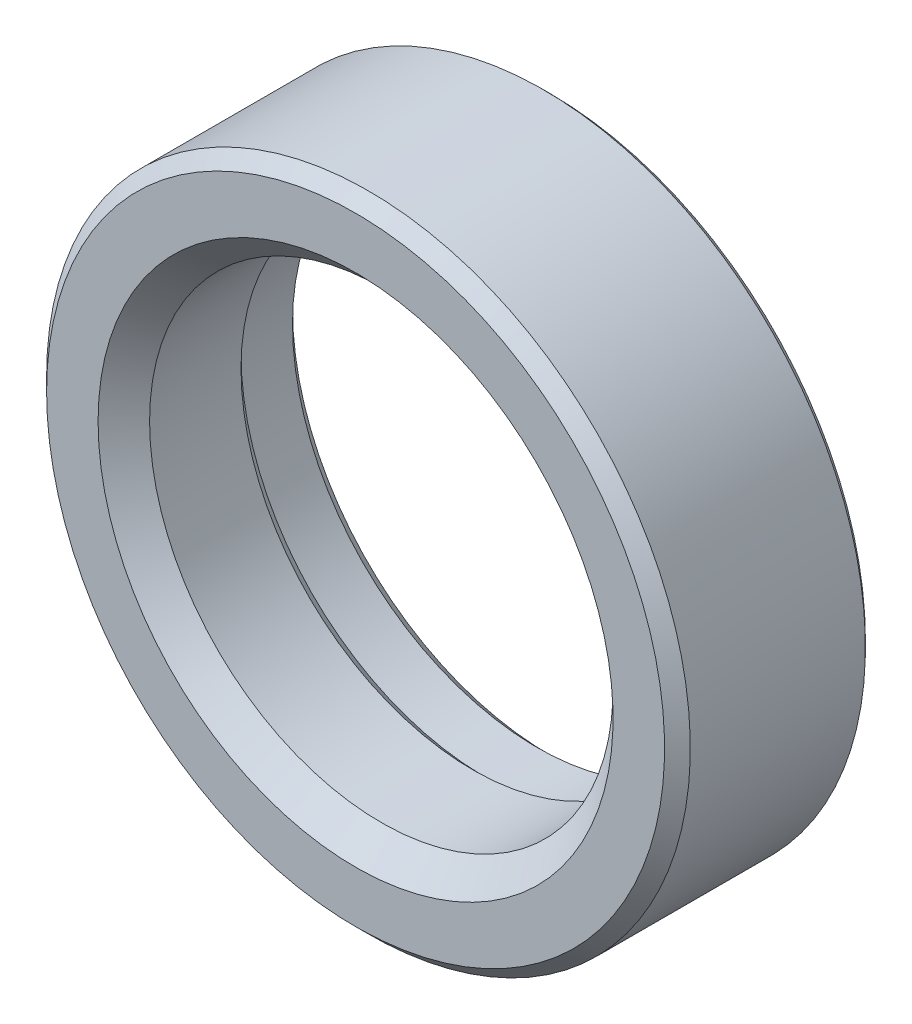
ISO-10303-21;
HEADER;
FILE_DESCRIPTION(('STEP AP214'),'2;1');
FILE_NAME('part.step','',(''),(''),'','','');
FILE_SCHEMA(('AUTOMOTIVE_DESIGN { 1 0 10303 214 1 1 1 1 }'));
ENDSEC;
DATA;
#1=APPLICATION_CONTEXT('core data for automotive mechanical design processes');
#2=APPLICATION_PROTOCOL_DEFINITION('international standard','automotive_design',2000,#1);
#3=PRODUCT_CONTEXT('',#1,'mechanical');
#4=PRODUCT('Part','Part','',(#3));
#5=PRODUCT_RELATED_PRODUCT_CATEGORY('part','',(#4));
#6=PRODUCT_DEFINITION_FORMATION('','',#4);
#7=PRODUCT_DEFINITION_CONTEXT('part definition',#1,'design');
#8=PRODUCT_DEFINITION('design','',#6,#7);
#9=PRODUCT_DEFINITION_SHAPE('','',#8);
#10=(LENGTH_UNIT() NAMED_UNIT(*) SI_UNIT(.MILLI.,.METRE.));
#11=(NAMED_UNIT(*) PLANE_ANGLE_UNIT() SI_UNIT($,.RADIAN.));
#12=(NAMED_UNIT(*) SI_UNIT($,.STERADIAN.) SOLID_ANGLE_UNIT());
#13=UNCERTAINTY_MEASURE_WITH_UNIT(LENGTH_MEASURE(1.E-05),#10,'distance_accuracy_value','');
#14=(GEOMETRIC_REPRESENTATION_CONTEXT(3) GLOBAL_UNCERTAINTY_ASSIGNED_CONTEXT((#13)) GLOBAL_UNIT_ASSIGNED_CONTEXT((#10,
#11,#12)) REPRESENTATION_CONTEXT('',''));
#15=CARTESIAN_POINT('',(0.,0.,0.));
#16=DIRECTION('',(0.,0.,1.));
#17=DIRECTION('',(1.,0.,0.));
#18=AXIS2_PLACEMENT_3D('',#15,#16,#17);
#19=CARTESIAN_POINT('',(0.,-18.,-7.59467455621301));
#20=DIRECTION('',(0.,0.,-1.));
#21=DIRECTION('',(-1.,0.,0.));
#22=AXIS2_PLACEMENT_3D('',#19,#20,#21);
#23=CYLINDRICAL_SURFACE('',#22,18.);
#24=CARTESIAN_POINT('',(0.,-18.,-1.59467455621303));
#25=DIRECTION('',(0.,0.,-1.));
#26=DIRECTION('',(-1.,0.,0.));
#27=AXIS2_PLACEMENT_3D('',#24,#25,#26);
#28=CIRCLE('',#27,18.);
#29=CARTESIAN_POINT('',(-18.,-18.,-1.59467455621303));
#30=VERTEX_POINT('',#29);
#31=EDGE_CURVE('E132',#30,#30,#28,.T.);
#32=ORIENTED_EDGE('',*,*,#31,.T.);
#33=EDGE_LOOP('',(#32));
#34=FACE_BOUND('',#33,.T.);
#35=CARTESIAN_POINT('',(0.,-18.,5.50532544378698));
#36=DIRECTION('',(0.,0.,-1.));
#37=DIRECTION('',(-1.,0.,0.));
#38=AXIS2_PLACEMENT_3D('',#35,#36,#37);
#39=CIRCLE('',#38,18.);
#40=CARTESIAN_POINT('',(-18.,-18.,5.50532544378698));
#41=VERTEX_POINT('',#40);
#42=EDGE_CURVE('E147',#41,#41,#39,.T.);
#43=ORIENTED_EDGE('',*,*,#42,.F.);
#44=EDGE_LOOP('',(#43));
#45=FACE_BOUND('',#44,.T.);
#46=ADVANCED_FACE('F41',(#34,#45),#23,.F.);
#47=CARTESIAN_POINT('',(0.,7.,-7.59467455621301));
#48=DIRECTION('',(0.,0.,-1.));
#49=DIRECTION('',(-1.,0.,0.));
#50=AXIS2_PLACEMENT_3D('',#47,#48,#49);
#51=PLANE('',#50);
#52=CARTESIAN_POINT('',(19.0525588832576,-29.,-7.59467455621301));
#53=DIRECTION('',(0.,0.,-1.));
#54=DIRECTION('',(-1.,0.,0.));
#55=AXIS2_PLACEMENT_3D('',#52,#53,#54);
#56=CIRCLE('',#55,1.45000000000001);
#57=CARTESIAN_POINT('',(17.6025588832576,-29.,-7.59467455621301));
#58=VERTEX_POINT('',#57);
#59=EDGE_CURVE('E84',#58,#58,#56,.F.);
#60=ORIENTED_EDGE('',*,*,#59,.T.);
#61=EDGE_LOOP('',(#60));
#62=FACE_BOUND('',#61,.T.);
#63=CARTESIAN_POINT('',(11.,-37.0525588832577,-7.59467455621301));
#64=DIRECTION('',(0.,0.,-1.));
#65=DIRECTION('',(-1.,0.,0.));
#66=AXIS2_PLACEMENT_3D('',#63,#64,#65);
#67=CIRCLE('',#66,1.44999999999999);
#68=CARTESIAN_POINT('',(9.55000000000001,-37.0525588832577,-7.59467455621301));
#69=VERTEX_POINT('',#68);
#70=EDGE_CURVE('E88',#69,#69,#67,.F.);
#71=ORIENTED_EDGE('',*,*,#70,.T.);
#72=EDGE_LOOP('',(#71));
#73=FACE_BOUND('',#72,.T.);
#74=CARTESIAN_POINT('',(0.,-40.,-7.59467455621301));
#75=DIRECTION('',(0.,0.,-1.));
#76=DIRECTION('',(-1.,0.,0.));
#77=AXIS2_PLACEMENT_3D('',#74,#75,#76);
#78=CIRCLE('',#77,1.44999999999999);
#79=CARTESIAN_POINT('',(-1.44999999999999,-40.,-7.59467455621301));
#80=VERTEX_POINT('',#79);
#81=EDGE_CURVE('E87',#80,#80,#78,.F.);
#82=ORIENTED_EDGE('',*,*,#81,.T.);
#83=EDGE_LOOP('',(#82));
#84=FACE_BOUND('',#83,.T.);
#85=CARTESIAN_POINT('',(-11.,-37.0525588832576,-7.59467455621301));
#86=DIRECTION('',(0.,0.,-1.));
#87=DIRECTION('',(-1.,0.,0.));
#88=AXIS2_PLACEMENT_3D('',#85,#86,#87);
#89=CIRCLE('',#88,1.45000000000001);
#90=CARTESIAN_POINT('',(-12.45,-37.0525588832576,-7.59467455621301));
#91=VERTEX_POINT('',#90);
#92=EDGE_CURVE('E94',#91,#91,#89,.F.);
#93=ORIENTED_EDGE('',*,*,#92,.T.);
#94=EDGE_LOOP('',(#93));
#95=FACE_BOUND('',#94,.T.);
#96=CARTESIAN_POINT('',(-19.0525588832577,-29.,-7.59467455621301));
#97=DIRECTION('',(0.,0.,-1.));
#98=DIRECTION('',(-1.,0.,0.));
#99=AXIS2_PLACEMENT_3D('',#96,#97,#98);
#100=CIRCLE('',#99,1.45000000000001);
#101=CARTESIAN_POINT('',(-20.5025588832577,-29.,-7.59467455621301));
#102=VERTEX_POINT('',#101);
#103=EDGE_CURVE('E91',#102,#102,#100,.F.);
#104=ORIENTED_EDGE('',*,*,#103,.T.);
#105=EDGE_LOOP('',(#104));
#106=FACE_BOUND('',#105,.T.);
#107=CARTESIAN_POINT('',(-22.,-18.,-7.59467455621301));
#108=DIRECTION('',(0.,0.,-1.));
#109=DIRECTION('',(-1.,0.,0.));
#110=AXIS2_PLACEMENT_3D('',#107,#108,#109);
#111=CIRCLE('',#110,1.45000000000001);
#112=CARTESIAN_POINT('',(-23.45,-18.,-7.59467455621301));
#113=VERTEX_POINT('',#112);
#114=EDGE_CURVE('E96',#113,#113,#111,.F.);
#115=ORIENTED_EDGE('',*,*,#114,.T.);
#116=EDGE_LOOP('',(#115));
#117=FACE_BOUND('',#116,.T.);
#118=CARTESIAN_POINT('',(-19.0525588832577,-7.,-7.59467455621301));
#119=DIRECTION('',(0.,0.,-1.));
#120=DIRECTION('',(-1.,0.,0.));
#121=AXIS2_PLACEMENT_3D('',#118,#119,#120);
#122=CIRCLE('',#121,1.45000000000001);
#123=CARTESIAN_POINT('',(-20.5025588832577,-7.,-7.59467455621301));
#124=VERTEX_POINT('',#123);
#125=EDGE_CURVE('E103',#124,#124,#122,.F.);
#126=ORIENTED_EDGE('',*,*,#125,.T.);
#127=EDGE_LOOP('',(#126));
#128=FACE_BOUND('',#127,.T.);
#129=CARTESIAN_POINT('',(-11.,1.05255888325765,-7.59467455621301));
#130=DIRECTION('',(0.,0.,-1.));
#131=DIRECTION('',(-1.,0.,0.));
#132=AXIS2_PLACEMENT_3D('',#129,#130,#131);
#133=CIRCLE('',#132,1.45000000000001);
#134=CARTESIAN_POINT('',(-12.45,1.05255888325765,-7.59467455621301));
#135=VERTEX_POINT('',#134);
#136=EDGE_CURVE('E104',#135,#135,#133,.F.);
#137=ORIENTED_EDGE('',*,*,#136,.T.);
#138=EDGE_LOOP('',(#137));
#139=FACE_BOUND('',#138,.T.);
#140=CARTESIAN_POINT('',(0.,4.,-7.59467455621301));
#141=DIRECTION('',(0.,0.,-1.));
#142=DIRECTION('',(-1.,0.,0.));
#143=AXIS2_PLACEMENT_3D('',#140,#141,#142);
#144=CIRCLE('',#143,1.45000000000001);
#145=CARTESIAN_POINT('',(-1.45000000000001,4.,-7.59467455621301));
#146=VERTEX_POINT('',#145);
#147=EDGE_CURVE('E110',#146,#146,#144,.F.);
#148=ORIENTED_EDGE('',*,*,#147,.T.);
#149=EDGE_LOOP('',(#148));
#150=FACE_BOUND('',#149,.T.);
#151=CARTESIAN_POINT('',(11.,1.05255888325765,-7.59467455621301));
#152=DIRECTION('',(0.,0.,-1.));
#153=DIRECTION('',(-1.,0.,0.));
#154=AXIS2_PLACEMENT_3D('',#151,#152,#153);
#155=CIRCLE('',#154,1.45000000000001);
#156=CARTESIAN_POINT('',(9.55,1.05255888325765,-7.59467455621301));
#157=VERTEX_POINT('',#156);
#158=EDGE_CURVE('E109',#157,#157,#155,.F.);
#159=ORIENTED_EDGE('',*,*,#158,.T.);
#160=EDGE_LOOP('',(#159));
#161=FACE_BOUND('',#160,.T.);
#162=CARTESIAN_POINT('',(19.0525588832577,-7.00000000000001,-7.59467455621301));
#163=DIRECTION('',(0.,0.,-1.));
#164=DIRECTION('',(-1.,0.,0.));
#165=AXIS2_PLACEMENT_3D('',#162,#163,#164);
#166=CIRCLE('',#165,1.45000000000001);
#167=CARTESIAN_POINT('',(17.6025588832577,-7.00000000000001,-7.59467455621301));
#168=VERTEX_POINT('',#167);
#169=EDGE_CURVE('E113',#168,#168,#166,.F.);
#170=ORIENTED_EDGE('',*,*,#169,.T.);
#171=EDGE_LOOP('',(#170));
#172=FACE_BOUND('',#171,.T.);
#173=CARTESIAN_POINT('',(22.,-18.,-7.59467455621301));
#174=DIRECTION('',(0.,0.,-1.));
#175=DIRECTION('',(-1.,0.,0.));
#176=AXIS2_PLACEMENT_3D('',#173,#174,#175);
#177=CIRCLE('',#176,1.44999999999999);
#178=CARTESIAN_POINT('',(20.55,-18.,-7.59467455621301));
#179=VERTEX_POINT('',#178);
#180=EDGE_CURVE('E116',#179,#179,#177,.F.);
#181=ORIENTED_EDGE('',*,*,#180,.T.);
#182=EDGE_LOOP('',(#181));
#183=FACE_BOUND('',#182,.T.);
#184=CARTESIAN_POINT('',(0.,-18.,-7.59467455621301));
#185=DIRECTION('',(0.,0.,-1.));
#186=DIRECTION('',(-1.,0.,0.));
#187=AXIS2_PLACEMENT_3D('',#184,#185,#186);
#188=CIRCLE('',#187,20.);
#189=CARTESIAN_POINT('',(-20.,-18.,-7.59467455621301));
#190=VERTEX_POINT('',#189);
#191=EDGE_CURVE('E125',#190,#190,#188,.F.);
#192=ORIENTED_EDGE('',*,*,#191,.T.);
#193=EDGE_LOOP('',(#192));
#194=FACE_BOUND('',#193,.T.);
#195=CARTESIAN_POINT('',(0.,-18.,-7.59467455621301));
#196=DIRECTION('',(0.,0.,-1.));
#197=DIRECTION('',(-1.,0.,0.));
#198=AXIS2_PLACEMENT_3D('',#195,#196,#197);
#199=CIRCLE('',#198,24.5);
#200=CARTESIAN_POINT('',(-24.5,-18.,-7.59467455621301));
#201=VERTEX_POINT('',#200);
#202=EDGE_CURVE('E133',#201,#201,#199,.T.);
#203=ORIENTED_EDGE('',*,*,#202,.T.);
#204=EDGE_LOOP('',(#203));
#205=FACE_BOUND('',#204,.T.);
#206=ADVANCED_FACE('F209',(#62,#73,#84,#95,#106,#117,#128,#139,#150,#161,#172,#183,#194,#205),
#51,.T.);
#207=CARTESIAN_POINT('',(0.,-18.,-7.59467455621301));
#208=DIRECTION('',(0.,0.,-1.));
#209=DIRECTION('',(-1.,0.,0.));
#210=AXIS2_PLACEMENT_3D('',#207,#208,#209);
#211=CYLINDRICAL_SURFACE('',#210,25.);
#212=CARTESIAN_POINT('',(0.,-18.,-7.09467455621301));
#213=DIRECTION('',(0.,0.,-1.));
#214=DIRECTION('',(-1.,0.,0.));
#215=AXIS2_PLACEMENT_3D('',#212,#213,#214);
#216=CIRCLE('',#215,25.);
#217=CARTESIAN_POINT('',(-25.,-18.,-7.09467455621301));
#218=VERTEX_POINT('',#217);
#219=EDGE_CURVE('E129',#218,#218,#216,.F.);
#220=ORIENTED_EDGE('',*,*,#219,.T.);
#221=EDGE_LOOP('',(#220));
#222=FACE_BOUND('',#221,.T.);
#223=CARTESIAN_POINT('',(0.,-18.,6.50532544378698));
#224=DIRECTION('',(0.,0.,-1.));
#225=DIRECTION('',(-1.,0.,0.));
#226=AXIS2_PLACEMENT_3D('',#223,#224,#225);
#227=CIRCLE('',#226,25.);
#228=CARTESIAN_POINT('',(-25.,-18.,6.50532544378698));
#229=VERTEX_POINT('',#228);
#230=EDGE_CURVE('E139',#229,#229,#227,.T.);
#231=ORIENTED_EDGE('',*,*,#230,.T.);
#232=EDGE_LOOP('',(#231));
#233=FACE_BOUND('',#232,.T.);
#234=ADVANCED_FACE('F220',(#222,#233),#211,.T.);
#235=CARTESIAN_POINT('',(0.,-18.,6.50532544378698));
#236=DIRECTION('',(0.,0.,-1.));
#237=DIRECTION('',(-1.,0.,0.));
#238=AXIS2_PLACEMENT_3D('',#235,#236,#237);
#239=CONICAL_SURFACE('',#238,25.,0.785398163397448);
#240=CARTESIAN_POINT('',(0.,-18.,7.50532544378698));
#241=DIRECTION('',(0.,0.,-1.));
#242=DIRECTION('',(-1.,0.,0.));
#243=AXIS2_PLACEMENT_3D('',#240,#241,#242);
#244=CIRCLE('',#243,24.);
#245=CARTESIAN_POINT('',(-24.,-18.,7.50532544378698));
#246=VERTEX_POINT('',#245);
#247=EDGE_CURVE('E136',#246,#246,#244,.T.);
#248=ORIENTED_EDGE('',*,*,#247,.T.);
#249=EDGE_LOOP('',(#248));
#250=FACE_BOUND('',#249,.T.);
#251=ORIENTED_EDGE('',*,*,#230,.F.);
#252=EDGE_LOOP('',(#251));
#253=FACE_BOUND('',#252,.T.);
#254=ADVANCED_FACE('F233',(#250,#253),#239,.T.);
#255=CARTESIAN_POINT('',(0.,2.,7.50532544378698));
#256=DIRECTION('',(0.,0.,1.));
#257=DIRECTION('',(1.,0.,0.));
#258=AXIS2_PLACEMENT_3D('',#255,#256,#257);
#259=PLANE('',#258);
#260=CARTESIAN_POINT('',(0.,-18.,7.50532544378698));
#261=DIRECTION('',(0.,0.,-1.));
#262=DIRECTION('',(-1.,0.,0.));
#263=AXIS2_PLACEMENT_3D('',#260,#261,#262);
#264=CIRCLE('',#263,20.);
#265=CARTESIAN_POINT('',(-20.,-18.,7.50532544378698));
#266=VERTEX_POINT('',#265);
#267=EDGE_CURVE('E141',#266,#266,#264,.T.);
#268=ORIENTED_EDGE('',*,*,#267,.T.);
#269=EDGE_LOOP('',(#268));
#270=FACE_BOUND('',#269,.T.);
#271=ORIENTED_EDGE('',*,*,#247,.F.);
#272=EDGE_LOOP('',(#271));
#273=FACE_BOUND('',#272,.T.);
#274=ADVANCED_FACE('F227',(#270,#273),#259,.T.);
#275=CARTESIAN_POINT('',(0.,-18.,7.50532544378698));
#276=DIRECTION('',(0.,0.,1.));
#277=DIRECTION('',(1.,0.,0.));
#278=AXIS2_PLACEMENT_3D('',#275,#276,#277);
#279=CONICAL_SURFACE('',#278,20.,0.785398163397449);
#280=ORIENTED_EDGE('',*,*,#42,.T.);
#281=EDGE_LOOP('',(#280));
#282=FACE_BOUND('',#281,.T.);
#283=ORIENTED_EDGE('',*,*,#267,.F.);
#284=EDGE_LOOP('',(#283));
#285=FACE_BOUND('',#284,.T.);
#286=ADVANCED_FACE('F221',(#282,#285),#279,.F.);
#287=CARTESIAN_POINT('',(0.,-18.,-2.59467455621301));
#288=DIRECTION('',(0.,0.,-1.));
#289=DIRECTION('',(-1.,0.,0.));
#290=AXIS2_PLACEMENT_3D('',#287,#288,#289);
#291=CYLINDRICAL_SURFACE('',#290,19.);
#292=CARTESIAN_POINT('',(0.,-18.,-6.59467455621301));
#293=DIRECTION('',(0.,0.,-1.));
#294=DIRECTION('',(-1.,0.,0.));
#295=AXIS2_PLACEMENT_3D('',#292,#293,#294);
#296=CIRCLE('',#295,19.);
#297=CARTESIAN_POINT('',(-19.,-18.,-6.59467455621301));
#298=VERTEX_POINT('',#297);
#299=EDGE_CURVE('E123',#298,#298,#296,.T.);
#300=ORIENTED_EDGE('',*,*,#299,.T.);
#301=EDGE_LOOP('',(#300));
#302=FACE_BOUND('',#301,.T.);
#303=CARTESIAN_POINT('',(0.,-18.,-2.59467455621301));
#304=DIRECTION('',(0.,0.,-1.));
#305=DIRECTION('',(-1.,0.,0.));
#306=AXIS2_PLACEMENT_3D('',#303,#304,#305);
#307=CIRCLE('',#306,19.);
#308=CARTESIAN_POINT('',(-19.,-18.,-2.59467455621301));
#309=VERTEX_POINT('',#308);
#310=EDGE_CURVE('E146',#309,#309,#307,.T.);
#311=ORIENTED_EDGE('',*,*,#310,.F.);
#312=EDGE_LOOP('',(#311));
#313=FACE_BOUND('',#312,.T.);
#314=ADVANCED_FACE('F222',(#302,#313),#291,.F.);
#315=CARTESIAN_POINT('',(0.,-18.,-1.59467455621303));
#316=DIRECTION('',(0.,0.,-1.));
#317=DIRECTION('',(-1.,0.,0.));
#318=AXIS2_PLACEMENT_3D('',#315,#316,#317);
#319=CONICAL_SURFACE('',#318,18.,0.785398163397448);
#320=ORIENTED_EDGE('',*,*,#310,.T.);
#321=EDGE_LOOP('',(#320));
#322=FACE_BOUND('',#321,.T.);
#323=ORIENTED_EDGE('',*,*,#31,.F.);
#324=EDGE_LOOP('',(#323));
#325=FACE_BOUND('',#324,.T.);
#326=ADVANCED_FACE('F239',(#322,#325),#319,.F.);
#327=CARTESIAN_POINT('',(0.,-18.,-7.59467455621301));
#328=DIRECTION('',(0.,0.,1.));
#329=DIRECTION('',(1.,0.,0.));
#330=AXIS2_PLACEMENT_3D('',#327,#328,#329);
#331=CONICAL_SURFACE('',#330,24.5,0.785398163397431);
#332=ORIENTED_EDGE('',*,*,#219,.F.);
#333=EDGE_LOOP('',(#332));
#334=FACE_BOUND('',#333,.T.);
#335=ORIENTED_EDGE('',*,*,#202,.F.);
#336=EDGE_LOOP('',(#335));
#337=FACE_BOUND('',#336,.T.);
#338=ADVANCED_FACE('F244',(#334,#337),#331,.T.);
#339=CARTESIAN_POINT('',(0.,-18.,-6.59467455621301));
#340=DIRECTION('',(0.,0.,-1.));
#341=DIRECTION('',(-1.,0.,0.));
#342=AXIS2_PLACEMENT_3D('',#339,#340,#341);
#343=CONICAL_SURFACE('',#342,19.,0.78539816339745);
#344=ORIENTED_EDGE('',*,*,#191,.F.);
#345=EDGE_LOOP('',(#344));
#346=FACE_BOUND('',#345,.T.);
#347=ORIENTED_EDGE('',*,*,#299,.F.);
#348=EDGE_LOOP('',(#347));
#349=FACE_BOUND('',#348,.T.);
#350=ADVANCED_FACE('F255',(#346,#349),#343,.F.);
#351=CARTESIAN_POINT('',(19.0525588832576,-29.,-0.0946745562130143));
#352=DIRECTION('',(0.,0.,-1.));
#353=DIRECTION('',(-1.,0.,0.));
#354=AXIS2_PLACEMENT_3D('',#351,#352,#353);
#355=CYLINDRICAL_SURFACE('',#354,1.25);
#356=CARTESIAN_POINT('',(19.0525588832576,-29.,-7.39467455621301));
#357=DIRECTION('',(0.,0.,-1.));
#358=DIRECTION('',(-1.,0.,0.));
#359=AXIS2_PLACEMENT_3D('',#356,#357,#358);
#360=CIRCLE('',#359,1.25);
#361=CARTESIAN_POINT('',(17.8025588832576,-29.,-7.39467455621301));
#362=VERTEX_POINT('',#361);
#363=EDGE_CURVE('E118',#362,#362,#360,.T.);
#364=ORIENTED_EDGE('',*,*,#363,.T.);
#365=EDGE_LOOP('',(#364));
#366=FACE_BOUND('',#365,.T.);
#367=CARTESIAN_POINT('',(19.0525588832576,-29.,-0.0946745562130143));
#368=DIRECTION('',(0.,0.,-1.));
#369=DIRECTION('',(-1.,0.,0.));
#370=AXIS2_PLACEMENT_3D('',#367,#368,#369);
#371=CIRCLE('',#370,1.25);
#372=CARTESIAN_POINT('',(17.8025588832576,-29.,-0.0946745562130143));
#373=VERTEX_POINT('',#372);
#374=EDGE_CURVE('E168',#373,#373,#371,.T.);
#375=ORIENTED_EDGE('',*,*,#374,.F.);
#376=EDGE_LOOP('',(#375));
#377=FACE_BOUND('',#376,.T.);
#378=ADVANCED_FACE('F256',(#366,#377),#355,.F.);
#379=CARTESIAN_POINT('',(19.0525588832576,-29.,-0.0946745562130143));
#380=DIRECTION('',(0.,0.,-1.));
#381=DIRECTION('',(-1.,0.,0.));
#382=AXIS2_PLACEMENT_3D('',#379,#380,#381);
#383=PLANE('',#382);
#384=ORIENTED_EDGE('',*,*,#374,.T.);
#385=EDGE_LOOP('',(#384));
#386=FACE_BOUND('',#385,.T.);
#387=ADVANCED_FACE('F371',(#386),#383,.T.);
#388=CARTESIAN_POINT('',(11.,-37.0525588832577,-0.0946745562130143));
#389=DIRECTION('',(0.,0.,-1.));
#390=DIRECTION('',(-1.,0.,0.));
#391=AXIS2_PLACEMENT_3D('',#388,#389,#390);
#392=CYLINDRICAL_SURFACE('',#391,1.25);
#393=CARTESIAN_POINT('',(11.,-37.0525588832577,-7.39467455621303));
#394=DIRECTION('',(0.,0.,-1.));
#395=DIRECTION('',(-1.,0.,0.));
#396=AXIS2_PLACEMENT_3D('',#393,#394,#395);
#397=CIRCLE('',#396,1.25);
#398=CARTESIAN_POINT('',(9.74999999999999,-37.0525588832577,-7.39467455621303));
#399=VERTEX_POINT('',#398);
#400=EDGE_CURVE('E78',#399,#399,#397,.T.);
#401=ORIENTED_EDGE('',*,*,#400,.T.);
#402=EDGE_LOOP('',(#401));
#403=FACE_BOUND('',#402,.T.);
#404=CARTESIAN_POINT('',(11.,-37.0525588832577,-0.0946745562130143));
#405=DIRECTION('',(0.,0.,-1.));
#406=DIRECTION('',(-1.,0.,0.));
#407=AXIS2_PLACEMENT_3D('',#404,#405,#406);
#408=CIRCLE('',#407,1.25);
#409=CARTESIAN_POINT('',(9.74999999999999,-37.0525588832577,-0.0946745562130143));
#410=VERTEX_POINT('',#409);
#411=EDGE_CURVE('E169',#410,#410,#408,.T.);
#412=ORIENTED_EDGE('',*,*,#411,.F.);
#413=EDGE_LOOP('',(#412));
#414=FACE_BOUND('',#413,.T.);
#415=ADVANCED_FACE('F374',(#403,#414),#392,.F.);
#416=CARTESIAN_POINT('',(11.,-37.0525588832577,-0.0946745562130143));
#417=DIRECTION('',(0.,0.,-1.));
#418=DIRECTION('',(-1.,0.,0.));
#419=AXIS2_PLACEMENT_3D('',#416,#417,#418);
#420=PLANE('',#419);
#421=ORIENTED_EDGE('',*,*,#411,.T.);
#422=EDGE_LOOP('',(#421));
#423=FACE_BOUND('',#422,.T.);
#424=ADVANCED_FACE('F385',(#423),#420,.T.);
#425=CARTESIAN_POINT('',(0.,-40.,-0.0946745562130143));
#426=DIRECTION('',(0.,0.,-1.));
#427=DIRECTION('',(-1.,0.,0.));
#428=AXIS2_PLACEMENT_3D('',#425,#426,#427);
#429=CYLINDRICAL_SURFACE('',#428,1.25);
#430=CARTESIAN_POINT('',(0.,-40.,-7.39467455621303));
#431=DIRECTION('',(0.,0.,-1.));
#432=DIRECTION('',(-1.,0.,0.));
#433=AXIS2_PLACEMENT_3D('',#430,#431,#432);
#434=CIRCLE('',#433,1.25);
#435=CARTESIAN_POINT('',(-1.25,-40.,-7.39467455621303));
#436=VERTEX_POINT('',#435);
#437=EDGE_CURVE('E80',#436,#436,#434,.T.);
#438=ORIENTED_EDGE('',*,*,#437,.T.);
#439=EDGE_LOOP('',(#438));
#440=FACE_BOUND('',#439,.T.);
#441=CARTESIAN_POINT('',(0.,-40.,-0.0946745562130143));
#442=DIRECTION('',(0.,0.,-1.));
#443=DIRECTION('',(-1.,0.,0.));
#444=AXIS2_PLACEMENT_3D('',#441,#442,#443);
#445=CIRCLE('',#444,1.25);
#446=CARTESIAN_POINT('',(-1.25,-40.,-0.0946745562130143));
#447=VERTEX_POINT('',#446);
#448=EDGE_CURVE('E173',#447,#447,#445,.T.);
#449=ORIENTED_EDGE('',*,*,#448,.F.);
#450=EDGE_LOOP('',(#449));
#451=FACE_BOUND('',#450,.T.);
#452=ADVANCED_FACE('F387',(#440,#451),#429,.F.);
#453=CARTESIAN_POINT('',(0.,-40.,-0.0946745562130143));
#454=DIRECTION('',(0.,0.,-1.));
#455=DIRECTION('',(-1.,0.,0.));
#456=AXIS2_PLACEMENT_3D('',#453,#454,#455);
#457=PLANE('',#456);
#458=ORIENTED_EDGE('',*,*,#448,.T.);
#459=EDGE_LOOP('',(#458));
#460=FACE_BOUND('',#459,.T.);
#461=ADVANCED_FACE('F391',(#460),#457,.T.);
#462=CARTESIAN_POINT('',(-11.,-37.0525588832576,-0.0946745562130143));
#463=DIRECTION('',(0.,0.,-1.));
#464=DIRECTION('',(-1.,0.,0.));
#465=AXIS2_PLACEMENT_3D('',#462,#463,#464);
#466=CYLINDRICAL_SURFACE('',#465,1.25);
#467=CARTESIAN_POINT('',(-11.,-37.0525588832576,-7.39467455621301));
#468=DIRECTION('',(0.,0.,-1.));
#469=DIRECTION('',(-1.,0.,0.));
#470=AXIS2_PLACEMENT_3D('',#467,#468,#469);
#471=CIRCLE('',#470,1.25);
#472=CARTESIAN_POINT('',(-12.25,-37.0525588832576,-7.39467455621301));
#473=VERTEX_POINT('',#472);
#474=EDGE_CURVE('E75',#473,#473,#471,.T.);
#475=ORIENTED_EDGE('',*,*,#474,.T.);
#476=EDGE_LOOP('',(#475));
#477=FACE_BOUND('',#476,.T.);
#478=CARTESIAN_POINT('',(-11.,-37.0525588832576,-0.0946745562130143));
#479=DIRECTION('',(0.,0.,-1.));
#480=DIRECTION('',(-1.,0.,0.));
#481=AXIS2_PLACEMENT_3D('',#478,#479,#480);
#482=CIRCLE('',#481,1.25);
#483=CARTESIAN_POINT('',(-12.25,-37.0525588832576,-0.0946745562130143));
#484=VERTEX_POINT('',#483);
#485=EDGE_CURVE('E159',#484,#484,#482,.T.);
#486=ORIENTED_EDGE('',*,*,#485,.F.);
#487=EDGE_LOOP('',(#486));
#488=FACE_BOUND('',#487,.T.);
#489=ADVANCED_FACE('F399',(#477,#488),#466,.F.);
#490=CARTESIAN_POINT('',(-11.,-37.0525588832576,-0.0946745562130143));
#491=DIRECTION('',(0.,0.,-1.));
#492=DIRECTION('',(-1.,0.,0.));
#493=AXIS2_PLACEMENT_3D('',#490,#491,#492);
#494=PLANE('',#493);
#495=ORIENTED_EDGE('',*,*,#485,.T.);
#496=EDGE_LOOP('',(#495));
#497=FACE_BOUND('',#496,.T.);
#498=ADVANCED_FACE('F404',(#497),#494,.T.);
#499=CARTESIAN_POINT('',(-19.0525588832577,-29.,-0.0946745562130143));
#500=DIRECTION('',(0.,0.,-1.));
#501=DIRECTION('',(-1.,0.,0.));
#502=AXIS2_PLACEMENT_3D('',#499,#500,#501);
#503=CYLINDRICAL_SURFACE('',#502,1.25);
#504=CARTESIAN_POINT('',(-19.0525588832577,-29.,-7.39467455621301));
#505=DIRECTION('',(0.,0.,-1.));
#506=DIRECTION('',(-1.,0.,0.));
#507=AXIS2_PLACEMENT_3D('',#504,#505,#506);
#508=CIRCLE('',#507,1.25);
#509=CARTESIAN_POINT('',(-20.3025588832577,-29.,-7.39467455621301));
#510=VERTEX_POINT('',#509);
#511=EDGE_CURVE('E73',#510,#510,#508,.T.);
#512=ORIENTED_EDGE('',*,*,#511,.T.);
#513=EDGE_LOOP('',(#512));
#514=FACE_BOUND('',#513,.T.);
#515=CARTESIAN_POINT('',(-19.0525588832577,-29.,-0.0946745562130143));
#516=DIRECTION('',(0.,0.,-1.));
#517=DIRECTION('',(-1.,0.,0.));
#518=AXIS2_PLACEMENT_3D('',#515,#516,#517);
#519=CIRCLE('',#518,1.25);
#520=CARTESIAN_POINT('',(-20.3025588832577,-29.,-0.0946745562130143));
#521=VERTEX_POINT('',#520);
#522=EDGE_CURVE('E151',#521,#521,#519,.T.);
#523=ORIENTED_EDGE('',*,*,#522,.F.);
#524=EDGE_LOOP('',(#523));
#525=FACE_BOUND('',#524,.T.);
#526=ADVANCED_FACE('F409',(#514,#525),#503,.F.);
#527=CARTESIAN_POINT('',(-19.0525588832577,-29.,-0.0946745562130143));
#528=DIRECTION('',(0.,0.,-1.));
#529=DIRECTION('',(-1.,0.,0.));
#530=AXIS2_PLACEMENT_3D('',#527,#528,#529);
#531=PLANE('',#530);
#532=ORIENTED_EDGE('',*,*,#522,.T.);
#533=EDGE_LOOP('',(#532));
#534=FACE_BOUND('',#533,.T.);
#535=ADVANCED_FACE('F414',(#534),#531,.T.);
#536=CARTESIAN_POINT('',(-22.,-18.,-0.0946745562130143));
#537=DIRECTION('',(0.,0.,-1.));
#538=DIRECTION('',(-1.,0.,0.));
#539=AXIS2_PLACEMENT_3D('',#536,#537,#538);
#540=CYLINDRICAL_SURFACE('',#539,1.25);
#541=CARTESIAN_POINT('',(-22.,-18.,-7.39467455621301));
#542=DIRECTION('',(0.,0.,-1.));
#543=DIRECTION('',(-1.,0.,0.));
#544=AXIS2_PLACEMENT_3D('',#541,#542,#543);
#545=CIRCLE('',#544,1.25);
#546=CARTESIAN_POINT('',(-23.25,-18.,-7.39467455621301));
#547=VERTEX_POINT('',#546);
#548=EDGE_CURVE('E66',#547,#547,#545,.T.);
#549=ORIENTED_EDGE('',*,*,#548,.T.);
#550=EDGE_LOOP('',(#549));
#551=FACE_BOUND('',#550,.T.);
#552=CARTESIAN_POINT('',(-22.,-18.,-0.0946745562130143));
#553=DIRECTION('',(0.,0.,-1.));
#554=DIRECTION('',(-1.,0.,0.));
#555=AXIS2_PLACEMENT_3D('',#552,#553,#554);
#556=CIRCLE('',#555,1.25);
#557=CARTESIAN_POINT('',(-23.25,-18.,-0.0946745562130143));
#558=VERTEX_POINT('',#557);
#559=EDGE_CURVE('E158',#558,#558,#556,.T.);
#560=ORIENTED_EDGE('',*,*,#559,.F.);
#561=EDGE_LOOP('',(#560));
#562=FACE_BOUND('',#561,.T.);
#563=ADVANCED_FACE('F420',(#551,#562),#540,.F.);
#564=CARTESIAN_POINT('',(-22.,-18.,-0.0946745562130143));
#565=DIRECTION('',(0.,0.,-1.));
#566=DIRECTION('',(-1.,0.,0.));
#567=AXIS2_PLACEMENT_3D('',#564,#565,#566);
#568=PLANE('',#567);
#569=ORIENTED_EDGE('',*,*,#559,.T.);
#570=EDGE_LOOP('',(#569));
#571=FACE_BOUND('',#570,.T.);
#572=ADVANCED_FACE('F424',(#571),#568,.T.);
#573=CARTESIAN_POINT('',(-19.0525588832577,-7.,-0.0946745562130143));
#574=DIRECTION('',(0.,0.,-1.));
#575=DIRECTION('',(-1.,0.,0.));
#576=AXIS2_PLACEMENT_3D('',#573,#574,#575);
#577=CYLINDRICAL_SURFACE('',#576,1.25);
#578=CARTESIAN_POINT('',(-19.0525588832577,-7.,-7.39467455621301));
#579=DIRECTION('',(0.,0.,-1.));
#580=DIRECTION('',(-1.,0.,0.));
#581=AXIS2_PLACEMENT_3D('',#578,#579,#580);
#582=CIRCLE('',#581,1.25);
#583=CARTESIAN_POINT('',(-20.3025588832577,-7.,-7.39467455621301));
#584=VERTEX_POINT('',#583);
#585=EDGE_CURVE('E63',#584,#584,#582,.T.);
#586=ORIENTED_EDGE('',*,*,#585,.T.);
#587=EDGE_LOOP('',(#586));
#588=FACE_BOUND('',#587,.T.);
#589=CARTESIAN_POINT('',(-19.0525588832577,-7.,-0.0946745562130143));
#590=DIRECTION('',(0.,0.,-1.));
#591=DIRECTION('',(-1.,0.,0.));
#592=AXIS2_PLACEMENT_3D('',#589,#590,#591);
#593=CIRCLE('',#592,1.25);
#594=CARTESIAN_POINT('',(-20.3025588832577,-7.,-0.0946745562130143));
#595=VERTEX_POINT('',#594);
#596=EDGE_CURVE('E156',#595,#595,#593,.T.);
#597=ORIENTED_EDGE('',*,*,#596,.F.);
#598=EDGE_LOOP('',(#597));
#599=FACE_BOUND('',#598,.T.);
#600=ADVANCED_FACE('F429',(#588,#599),#577,.F.);
#601=CARTESIAN_POINT('',(-19.0525588832577,-7.,-0.0946745562130143));
#602=DIRECTION('',(0.,0.,-1.));
#603=DIRECTION('',(-1.,0.,0.));
#604=AXIS2_PLACEMENT_3D('',#601,#602,#603);
#605=PLANE('',#604);
#606=ORIENTED_EDGE('',*,*,#596,.T.);
#607=EDGE_LOOP('',(#606));
#608=FACE_BOUND('',#607,.T.);
#609=ADVANCED_FACE('F436',(#608),#605,.T.);
#610=CARTESIAN_POINT('',(-11.,1.05255888325765,-0.0946745562130143));
#611=DIRECTION('',(0.,0.,-1.));
#612=DIRECTION('',(-1.,0.,0.));
#613=AXIS2_PLACEMENT_3D('',#610,#611,#612);
#614=CYLINDRICAL_SURFACE('',#613,1.25);
#615=CARTESIAN_POINT('',(-11.,1.05255888325765,-7.39467455621301));
#616=DIRECTION('',(0.,0.,-1.));
#617=DIRECTION('',(-1.,0.,0.));
#618=AXIS2_PLACEMENT_3D('',#615,#616,#617);
#619=CIRCLE('',#618,1.25);
#620=CARTESIAN_POINT('',(-12.25,1.05255888325765,-7.39467455621301));
#621=VERTEX_POINT('',#620);
#622=EDGE_CURVE('E65',#621,#621,#619,.T.);
#623=ORIENTED_EDGE('',*,*,#622,.T.);
#624=EDGE_LOOP('',(#623));
#625=FACE_BOUND('',#624,.T.);
#626=CARTESIAN_POINT('',(-11.,1.05255888325765,-0.0946745562130143));
#627=DIRECTION('',(0.,0.,-1.));
#628=DIRECTION('',(-1.,0.,0.));
#629=AXIS2_PLACEMENT_3D('',#626,#627,#628);
#630=CIRCLE('',#629,1.25);
#631=CARTESIAN_POINT('',(-12.25,1.05255888325765,-0.0946745562130143));
#632=VERTEX_POINT('',#631);
#633=EDGE_CURVE('E161',#632,#632,#630,.T.);
#634=ORIENTED_EDGE('',*,*,#633,.F.);
#635=EDGE_LOOP('',(#634));
#636=FACE_BOUND('',#635,.T.);
#637=ADVANCED_FACE('F439',(#625,#636),#614,.F.);
#638=CARTESIAN_POINT('',(-11.,1.05255888325765,-0.0946745562130143));
#639=DIRECTION('',(0.,0.,-1.));
#640=DIRECTION('',(-1.,0.,0.));
#641=AXIS2_PLACEMENT_3D('',#638,#639,#640);
#642=PLANE('',#641);
#643=ORIENTED_EDGE('',*,*,#633,.T.);
#644=EDGE_LOOP('',(#643));
#645=FACE_BOUND('',#644,.T.);
#646=ADVANCED_FACE('F450',(#645),#642,.T.);
#647=CARTESIAN_POINT('',(22.,-18.,-0.0946745562130143));
#648=DIRECTION('',(0.,0.,-1.));
#649=DIRECTION('',(-1.,0.,0.));
#650=AXIS2_PLACEMENT_3D('',#647,#648,#649);
#651=CYLINDRICAL_SURFACE('',#650,1.25);
#652=CARTESIAN_POINT('',(22.,-18.,-7.39467455621303));
#653=DIRECTION('',(0.,0.,-1.));
#654=DIRECTION('',(-1.,0.,0.));
#655=AXIS2_PLACEMENT_3D('',#652,#653,#654);
#656=CIRCLE('',#655,1.25);
#657=CARTESIAN_POINT('',(20.75,-18.,-7.39467455621303));
#658=VERTEX_POINT('',#657);
#659=EDGE_CURVE('E10',#658,#658,#656,.T.);
#660=ORIENTED_EDGE('',*,*,#659,.T.);
#661=EDGE_LOOP('',(#660));
#662=FACE_BOUND('',#661,.T.);
#663=CARTESIAN_POINT('',(22.,-18.,-0.0946745562130143));
#664=DIRECTION('',(0.,0.,-1.));
#665=DIRECTION('',(-1.,0.,0.));
#666=AXIS2_PLACEMENT_3D('',#663,#664,#665);
#667=CIRCLE('',#666,1.25);
#668=CARTESIAN_POINT('',(20.75,-18.,-0.0946745562130143));
#669=VERTEX_POINT('',#668);
#670=EDGE_CURVE('E167',#669,#669,#667,.T.);
#671=ORIENTED_EDGE('',*,*,#670,.F.);
#672=EDGE_LOOP('',(#671));
#673=FACE_BOUND('',#672,.T.);
#674=ADVANCED_FACE('F452',(#662,#673),#651,.F.);
#675=CARTESIAN_POINT('',(22.,-18.,-0.0946745562130143));
#676=DIRECTION('',(0.,0.,-1.));
#677=DIRECTION('',(-1.,0.,0.));
#678=AXIS2_PLACEMENT_3D('',#675,#676,#677);
#679=PLANE('',#678);
#680=ORIENTED_EDGE('',*,*,#670,.T.);
#681=EDGE_LOOP('',(#680));
#682=FACE_BOUND('',#681,.T.);
#683=ADVANCED_FACE('F456',(#682),#679,.T.);
#684=CARTESIAN_POINT('',(19.0525588832577,-7.00000000000001,-0.0946745562130143));
#685=DIRECTION('',(0.,0.,-1.));
#686=DIRECTION('',(-1.,0.,0.));
#687=AXIS2_PLACEMENT_3D('',#684,#685,#686);
#688=CYLINDRICAL_SURFACE('',#687,1.25);
#689=CARTESIAN_POINT('',(19.0525588832577,-7.00000000000001,-7.39467455621301));
#690=DIRECTION('',(0.,0.,-1.));
#691=DIRECTION('',(-1.,0.,0.));
#692=AXIS2_PLACEMENT_3D('',#689,#690,#691);
#693=CIRCLE('',#692,1.25);
#694=CARTESIAN_POINT('',(17.8025588832577,-7.00000000000001,-7.39467455621301));
#695=VERTEX_POINT('',#694);
#696=EDGE_CURVE('E47',#695,#695,#693,.T.);
#697=ORIENTED_EDGE('',*,*,#696,.T.);
#698=EDGE_LOOP('',(#697));
#699=FACE_BOUND('',#698,.T.);
#700=CARTESIAN_POINT('',(19.0525588832577,-7.00000000000001,-0.0946745562130143));
#701=DIRECTION('',(0.,0.,-1.));
#702=DIRECTION('',(-1.,0.,0.));
#703=AXIS2_PLACEMENT_3D('',#700,#701,#702);
#704=CIRCLE('',#703,1.25);
#705=CARTESIAN_POINT('',(17.8025588832577,-7.00000000000001,-0.0946745562130143));
#706=VERTEX_POINT('',#705);
#707=EDGE_CURVE('E181',#706,#706,#704,.T.);
#708=ORIENTED_EDGE('',*,*,#707,.F.);
#709=EDGE_LOOP('',(#708));
#710=FACE_BOUND('',#709,.T.);
#711=ADVANCED_FACE('F464',(#699,#710),#688,.F.);
#712=CARTESIAN_POINT('',(19.0525588832577,-7.00000000000001,-0.0946745562130143));
#713=DIRECTION('',(0.,0.,-1.));
#714=DIRECTION('',(-1.,0.,0.));
#715=AXIS2_PLACEMENT_3D('',#712,#713,#714);
#716=PLANE('',#715);
#717=ORIENTED_EDGE('',*,*,#707,.T.);
#718=EDGE_LOOP('',(#717));
#719=FACE_BOUND('',#718,.T.);
#720=ADVANCED_FACE('F469',(#719),#716,.T.);
#721=CARTESIAN_POINT('',(11.,1.05255888325765,-0.0946745562130143));
#722=DIRECTION('',(0.,0.,-1.));
#723=DIRECTION('',(-1.,0.,0.));
#724=AXIS2_PLACEMENT_3D('',#721,#722,#723);
#725=CYLINDRICAL_SURFACE('',#724,1.25);
#726=CARTESIAN_POINT('',(11.,1.05255888325765,-7.39467455621301));
#727=DIRECTION('',(0.,0.,-1.));
#728=DIRECTION('',(-1.,0.,0.));
#729=AXIS2_PLACEMENT_3D('',#726,#727,#728);
#730=CIRCLE('',#729,1.25);
#731=CARTESIAN_POINT('',(9.75000000000001,1.05255888325765,-7.39467455621301));
#732=VERTEX_POINT('',#731);
#733=EDGE_CURVE('E52',#732,#732,#730,.T.);
#734=ORIENTED_EDGE('',*,*,#733,.T.);
#735=EDGE_LOOP('',(#734));
#736=FACE_BOUND('',#735,.T.);
#737=CARTESIAN_POINT('',(11.,1.05255888325765,-0.0946745562130143));
#738=DIRECTION('',(0.,0.,-1.));
#739=DIRECTION('',(-1.,0.,0.));
#740=AXIS2_PLACEMENT_3D('',#737,#738,#739);
#741=CIRCLE('',#740,1.25);
#742=CARTESIAN_POINT('',(9.75000000000001,1.05255888325765,-0.0946745562130143));
#743=VERTEX_POINT('',#742);
#744=EDGE_CURVE('E178',#743,#743,#741,.T.);
#745=ORIENTED_EDGE('',*,*,#744,.F.);
#746=EDGE_LOOP('',(#745));
#747=FACE_BOUND('',#746,.T.);
#748=ADVANCED_FACE('F205',(#736,#747),#725,.F.);
#749=CARTESIAN_POINT('',(11.,1.05255888325765,-0.0946745562130143));
#750=DIRECTION('',(0.,0.,-1.));
#751=DIRECTION('',(-1.,0.,0.));
#752=AXIS2_PLACEMENT_3D('',#749,#750,#751);
#753=PLANE('',#752);
#754=ORIENTED_EDGE('',*,*,#744,.T.);
#755=EDGE_LOOP('',(#754));
#756=FACE_BOUND('',#755,.T.);
#757=ADVANCED_FACE('F194',(#756),#753,.T.);
#758=CARTESIAN_POINT('',(0.,4.,-0.0946745562130143));
#759=DIRECTION('',(0.,0.,-1.));
#760=DIRECTION('',(-1.,0.,0.));
#761=AXIS2_PLACEMENT_3D('',#758,#759,#760);
#762=CYLINDRICAL_SURFACE('',#761,1.25);
#763=CARTESIAN_POINT('',(0.,4.,-7.39467455621301));
#764=DIRECTION('',(0.,0.,-1.));
#765=DIRECTION('',(-1.,0.,0.));
#766=AXIS2_PLACEMENT_3D('',#763,#764,#765);
#767=CIRCLE('',#766,1.25);
#768=CARTESIAN_POINT('',(-1.25,4.,-7.39467455621301));
#769=VERTEX_POINT('',#768);
#770=EDGE_CURVE('E60',#769,#769,#767,.T.);
#771=ORIENTED_EDGE('',*,*,#770,.T.);
#772=EDGE_LOOP('',(#771));
#773=FACE_BOUND('',#772,.T.);
#774=CARTESIAN_POINT('',(0.,4.,-0.0946745562130143));
#775=DIRECTION('',(0.,0.,-1.));
#776=DIRECTION('',(-1.,0.,0.));
#777=AXIS2_PLACEMENT_3D('',#774,#775,#776);
#778=CIRCLE('',#777,1.25);
#779=CARTESIAN_POINT('',(-1.25,4.,-0.0946745562130143));
#780=VERTEX_POINT('',#779);
#781=EDGE_CURVE('E155',#780,#780,#778,.T.);
#782=ORIENTED_EDGE('',*,*,#781,.F.);
#783=EDGE_LOOP('',(#782));
#784=FACE_BOUND('',#783,.T.);
#785=ADVANCED_FACE('F192',(#773,#784),#762,.F.);
#786=CARTESIAN_POINT('',(0.,4.,-0.0946745562130143));
#787=DIRECTION('',(0.,0.,-1.));
#788=DIRECTION('',(-1.,0.,0.));
#789=AXIS2_PLACEMENT_3D('',#786,#787,#788);
#790=PLANE('',#789);
#791=ORIENTED_EDGE('',*,*,#781,.T.);
#792=EDGE_LOOP('',(#791));
#793=FACE_BOUND('',#792,.T.);
#794=ADVANCED_FACE('F186',(#793),#790,.T.);
#795=CARTESIAN_POINT('',(19.0525588832576,-29.,-7.39467455621301));
#796=DIRECTION('',(0.,0.,-1.));
#797=DIRECTION('',(-1.,0.,0.));
#798=AXIS2_PLACEMENT_3D('',#795,#796,#797);
#799=CONICAL_SURFACE('',#798,1.25,0.785398163397448);
#800=ORIENTED_EDGE('',*,*,#59,.F.);
#801=EDGE_LOOP('',(#800));
#802=FACE_BOUND('',#801,.T.);
#803=ORIENTED_EDGE('',*,*,#363,.F.);
#804=EDGE_LOOP('',(#803));
#805=FACE_BOUND('',#804,.T.);
#806=ADVANCED_FACE('F203',(#802,#805),#799,.F.);
#807=CARTESIAN_POINT('',(11.,-37.0525588832577,-7.39467455621303));
#808=DIRECTION('',(0.,0.,-1.));
#809=DIRECTION('',(-1.,0.,0.));
#810=AXIS2_PLACEMENT_3D('',#807,#808,#809);
#811=CONICAL_SURFACE('',#810,1.25,0.785398163397448);
#812=ORIENTED_EDGE('',*,*,#70,.F.);
#813=EDGE_LOOP('',(#812));
#814=FACE_BOUND('',#813,.T.);
#815=ORIENTED_EDGE('',*,*,#400,.F.);
#816=EDGE_LOOP('',(#815));
#817=FACE_BOUND('',#816,.T.);
#818=ADVANCED_FACE('F264',(#814,#817),#811,.F.);
#819=CARTESIAN_POINT('',(0.,-40.,-7.39467455621303));
#820=DIRECTION('',(0.,0.,-1.));
#821=DIRECTION('',(-1.,0.,0.));
#822=AXIS2_PLACEMENT_3D('',#819,#820,#821);
#823=CONICAL_SURFACE('',#822,1.25,0.78539816339745);
#824=ORIENTED_EDGE('',*,*,#81,.F.);
#825=EDGE_LOOP('',(#824));
#826=FACE_BOUND('',#825,.T.);
#827=ORIENTED_EDGE('',*,*,#437,.F.);
#828=EDGE_LOOP('',(#827));
#829=FACE_BOUND('',#828,.T.);
#830=ADVANCED_FACE('F275',(#826,#829),#823,.F.);
#831=CARTESIAN_POINT('',(-11.,-37.0525588832576,-7.39467455621301));
#832=DIRECTION('',(0.,0.,-1.));
#833=DIRECTION('',(-1.,0.,0.));
#834=AXIS2_PLACEMENT_3D('',#831,#832,#833);
#835=CONICAL_SURFACE('',#834,1.25,0.785398163397448);
#836=ORIENTED_EDGE('',*,*,#92,.F.);
#837=EDGE_LOOP('',(#836));
#838=FACE_BOUND('',#837,.T.);
#839=ORIENTED_EDGE('',*,*,#474,.F.);
#840=EDGE_LOOP('',(#839));
#841=FACE_BOUND('',#840,.T.);
#842=ADVANCED_FACE('F276',(#838,#841),#835,.F.);
#843=CARTESIAN_POINT('',(-19.0525588832577,-29.,-7.39467455621301));
#844=DIRECTION('',(0.,0.,-1.));
#845=DIRECTION('',(-1.,0.,0.));
#846=AXIS2_PLACEMENT_3D('',#843,#844,#845);
#847=CONICAL_SURFACE('',#846,1.25,0.785398163397448);
#848=ORIENTED_EDGE('',*,*,#103,.F.);
#849=EDGE_LOOP('',(#848));
#850=FACE_BOUND('',#849,.T.);
#851=ORIENTED_EDGE('',*,*,#511,.F.);
#852=EDGE_LOOP('',(#851));
#853=FACE_BOUND('',#852,.T.);
#854=ADVANCED_FACE('F288',(#850,#853),#847,.F.);
#855=CARTESIAN_POINT('',(-22.,-18.,-7.39467455621301));
#856=DIRECTION('',(0.,0.,-1.));
#857=DIRECTION('',(-1.,0.,0.));
#858=AXIS2_PLACEMENT_3D('',#855,#856,#857);
#859=CONICAL_SURFACE('',#858,1.25,0.785398163397448);
#860=ORIENTED_EDGE('',*,*,#114,.F.);
#861=EDGE_LOOP('',(#860));
#862=FACE_BOUND('',#861,.T.);
#863=ORIENTED_EDGE('',*,*,#548,.F.);
#864=EDGE_LOOP('',(#863));
#865=FACE_BOUND('',#864,.T.);
#866=ADVANCED_FACE('F291',(#862,#865),#859,.F.);
#867=CARTESIAN_POINT('',(-19.0525588832577,-7.,-7.39467455621301));
#868=DIRECTION('',(0.,0.,-1.));
#869=DIRECTION('',(-1.,0.,0.));
#870=AXIS2_PLACEMENT_3D('',#867,#868,#869);
#871=CONICAL_SURFACE('',#870,1.25,0.785398163397448);
#872=ORIENTED_EDGE('',*,*,#125,.F.);
#873=EDGE_LOOP('',(#872));
#874=FACE_BOUND('',#873,.T.);
#875=ORIENTED_EDGE('',*,*,#585,.F.);
#876=EDGE_LOOP('',(#875));
#877=FACE_BOUND('',#876,.T.);
#878=ADVANCED_FACE('F297',(#874,#877),#871,.F.);
#879=CARTESIAN_POINT('',(-11.,1.05255888325765,-7.39467455621301));
#880=DIRECTION('',(0.,0.,-1.));
#881=DIRECTION('',(-1.,0.,0.));
#882=AXIS2_PLACEMENT_3D('',#879,#880,#881);
#883=CONICAL_SURFACE('',#882,1.25,0.785398163397448);
#884=ORIENTED_EDGE('',*,*,#136,.F.);
#885=EDGE_LOOP('',(#884));
#886=FACE_BOUND('',#885,.T.);
#887=ORIENTED_EDGE('',*,*,#622,.F.);
#888=EDGE_LOOP('',(#887));
#889=FACE_BOUND('',#888,.T.);
#890=ADVANCED_FACE('F310',(#886,#889),#883,.F.);
#891=CARTESIAN_POINT('',(0.,4.,-7.39467455621301));
#892=DIRECTION('',(0.,0.,-1.));
#893=DIRECTION('',(-1.,0.,0.));
#894=AXIS2_PLACEMENT_3D('',#891,#892,#893);
#895=CONICAL_SURFACE('',#894,1.25,0.785398163397448);
#896=ORIENTED_EDGE('',*,*,#147,.F.);
#897=EDGE_LOOP('',(#896));
#898=FACE_BOUND('',#897,.T.);
#899=ORIENTED_EDGE('',*,*,#770,.F.);
#900=EDGE_LOOP('',(#899));
#901=FACE_BOUND('',#900,.T.);
#902=ADVANCED_FACE('F313',(#898,#901),#895,.F.);
#903=CARTESIAN_POINT('',(11.,1.05255888325765,-7.39467455621301));
#904=DIRECTION('',(0.,0.,-1.));
#905=DIRECTION('',(-1.,0.,0.));
#906=AXIS2_PLACEMENT_3D('',#903,#904,#905);
#907=CONICAL_SURFACE('',#906,1.25,0.785398163397448);
#908=ORIENTED_EDGE('',*,*,#158,.F.);
#909=EDGE_LOOP('',(#908));
#910=FACE_BOUND('',#909,.T.);
#911=ORIENTED_EDGE('',*,*,#733,.F.);
#912=EDGE_LOOP('',(#911));
#913=FACE_BOUND('',#912,.T.);
#914=ADVANCED_FACE('F322',(#910,#913),#907,.F.);
#915=CARTESIAN_POINT('',(19.0525588832577,-7.00000000000001,-7.39467455621301));
#916=DIRECTION('',(0.,0.,-1.));
#917=DIRECTION('',(-1.,0.,0.));
#918=AXIS2_PLACEMENT_3D('',#915,#916,#917);
#919=CONICAL_SURFACE('',#918,1.25,0.785398163397448);
#920=ORIENTED_EDGE('',*,*,#169,.F.);
#921=EDGE_LOOP('',(#920));
#922=FACE_BOUND('',#921,.T.);
#923=ORIENTED_EDGE('',*,*,#696,.F.);
#924=EDGE_LOOP('',(#923));
#925=FACE_BOUND('',#924,.T.);
#926=ADVANCED_FACE('F330',(#922,#925),#919,.F.);
#927=CARTESIAN_POINT('',(22.,-18.,-7.39467455621303));
#928=DIRECTION('',(0.,0.,-1.));
#929=DIRECTION('',(-1.,0.,0.));
#930=AXIS2_PLACEMENT_3D('',#927,#928,#929);
#931=CONICAL_SURFACE('',#930,1.25,0.785398163397448);
#932=ORIENTED_EDGE('',*,*,#180,.F.);
#933=EDGE_LOOP('',(#932));
#934=FACE_BOUND('',#933,.T.);
#935=ORIENTED_EDGE('',*,*,#659,.F.);
#936=EDGE_LOOP('',(#935));
#937=FACE_BOUND('',#936,.T.);
#938=ADVANCED_FACE('F42',(#934,#937),#931,.F.);
#939=CLOSED_SHELL('',(#46,#206,#234,#254,#274,#286,#314,#326,#338,#350,#378,#387,#415,#424,#452,
#461,#489,#498,#526,#535,#563,#572,#600,#609,#637,#646,#674,#683,#711,#720,#748,#757,#785,#794,
#806,#818,#830,#842,#854,#866,#878,#890,#902,#914,#926,#938));
#940=MANIFOLD_SOLID_BREP('B2',#939);
#941=ADVANCED_BREP_SHAPE_REPRESENTATION('',(#18,#940),#14);
#942=SHAPE_DEFINITION_REPRESENTATION(#9,#941);
ENDSEC;
END-ISO-10303-21;
